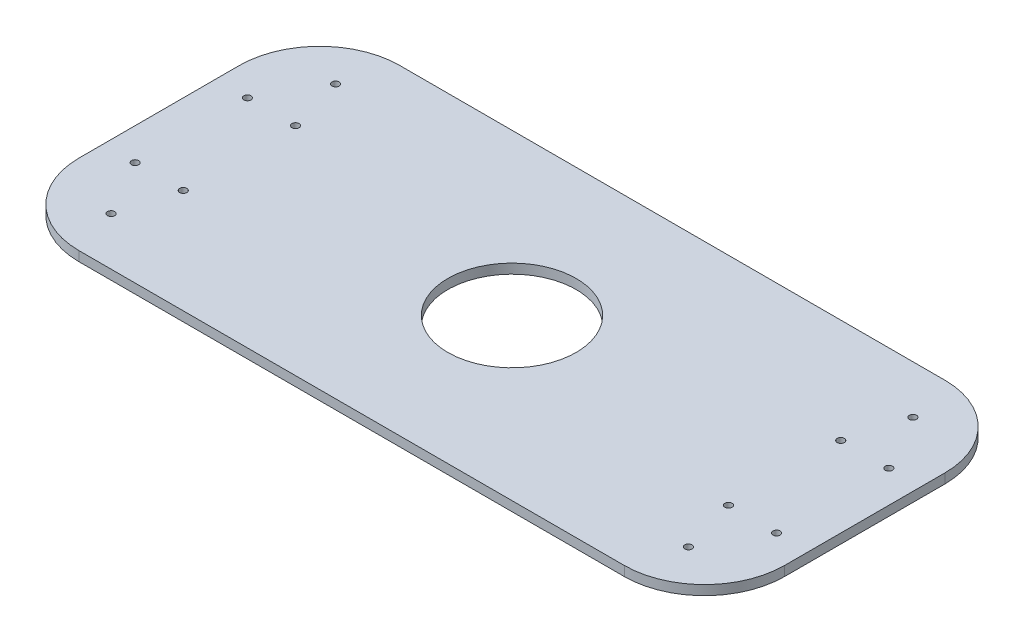
ISO-10303-21;
HEADER;
FILE_DESCRIPTION(('STEP AP214'),'2;1');
FILE_NAME('part.step','',(''),(''),'','','');
FILE_SCHEMA(('AUTOMOTIVE_DESIGN { 1 0 10303 214 1 1 1 1 }'));
ENDSEC;
DATA;
#1=APPLICATION_CONTEXT('core data for automotive mechanical design processes');
#2=APPLICATION_PROTOCOL_DEFINITION('international standard','automotive_design',2000,#1);
#3=PRODUCT_CONTEXT('',#1,'mechanical');
#4=PRODUCT('Part','Part','',(#3));
#5=PRODUCT_RELATED_PRODUCT_CATEGORY('part','',(#4));
#6=PRODUCT_DEFINITION_FORMATION('','',#4);
#7=PRODUCT_DEFINITION_CONTEXT('part definition',#1,'design');
#8=PRODUCT_DEFINITION('design','',#6,#7);
#9=PRODUCT_DEFINITION_SHAPE('','',#8);
#10=(LENGTH_UNIT() NAMED_UNIT(*) SI_UNIT(.MILLI.,.METRE.));
#11=(NAMED_UNIT(*) PLANE_ANGLE_UNIT() SI_UNIT($,.RADIAN.));
#12=(NAMED_UNIT(*) SI_UNIT($,.STERADIAN.) SOLID_ANGLE_UNIT());
#13=UNCERTAINTY_MEASURE_WITH_UNIT(LENGTH_MEASURE(1.E-05),#10,'distance_accuracy_value','');
#14=(GEOMETRIC_REPRESENTATION_CONTEXT(3) GLOBAL_UNCERTAINTY_ASSIGNED_CONTEXT((#13)) GLOBAL_UNIT_ASSIGNED_CONTEXT((#10,
#11,#12)) REPRESENTATION_CONTEXT('',''));
#15=CARTESIAN_POINT('',(0.,0.,0.));
#16=DIRECTION('',(0.,0.,1.));
#17=DIRECTION('',(1.,0.,0.));
#18=AXIS2_PLACEMENT_3D('',#15,#16,#17);
#19=CARTESIAN_POINT('',(0.,6.,0.));
#20=DIRECTION('',(0.,1.,0.));
#21=DIRECTION('',(0.,0.,1.));
#22=AXIS2_PLACEMENT_3D('',#19,#20,#21);
#23=PLANE('',#22);
#24=CARTESIAN_POINT('',(180.,6.,-70.));
#25=DIRECTION('',(0.,1.,0.));
#26=DIRECTION('',(0.,0.,1.));
#27=AXIS2_PLACEMENT_3D('',#24,#25,#26);
#28=CIRCLE('',#27,2.25000000000001);
#29=CARTESIAN_POINT('',(180.,6.,-67.75));
#30=VERTEX_POINT('',#29);
#31=EDGE_CURVE('E254',#30,#30,#28,.T.);
#32=ORIENTED_EDGE('',*,*,#31,.F.);
#33=EDGE_LOOP('',(#32));
#34=FACE_BOUND('',#33,.T.);
#35=CARTESIAN_POINT('',(170.,6.,-35.));
#36=DIRECTION('',(0.,1.,0.));
#37=DIRECTION('',(0.,0.,1.));
#38=AXIS2_PLACEMENT_3D('',#35,#36,#37);
#39=CIRCLE('',#38,2.25000000000001);
#40=CARTESIAN_POINT('',(170.,6.,-32.75));
#41=VERTEX_POINT('',#40);
#42=EDGE_CURVE('E258',#41,#41,#39,.T.);
#43=ORIENTED_EDGE('',*,*,#42,.F.);
#44=EDGE_LOOP('',(#43));
#45=FACE_BOUND('',#44,.T.);
#46=CARTESIAN_POINT('',(200.,6.,-35.));
#47=DIRECTION('',(0.,1.,0.));
#48=DIRECTION('',(0.,0.,1.));
#49=AXIS2_PLACEMENT_3D('',#46,#47,#48);
#50=CIRCLE('',#49,2.25000000000001);
#51=CARTESIAN_POINT('',(200.,6.,-32.75));
#52=VERTEX_POINT('',#51);
#53=EDGE_CURVE('E249',#52,#52,#50,.T.);
#54=ORIENTED_EDGE('',*,*,#53,.F.);
#55=EDGE_LOOP('',(#54));
#56=FACE_BOUND('',#55,.T.);
#57=CARTESIAN_POINT('',(-170.,6.,50.));
#58=DIRECTION('',(0.,1.,0.));
#59=DIRECTION('',(0.,0.,1.));
#60=AXIS2_PLACEMENT_3D('',#57,#58,#59);
#61=CIRCLE('',#60,50.);
#62=CARTESIAN_POINT('',(-170.,6.,100.));
#63=VERTEX_POINT('',#62);
#64=CARTESIAN_POINT('',(-220.,6.,50.));
#65=VERTEX_POINT('',#64);
#66=EDGE_CURVE('E241',#63,#65,#61,.F.);
#67=ORIENTED_EDGE('',*,*,#66,.F.);
#68=DIRECTION('',(1.,0.,0.));
#69=VECTOR('',#68,1.);
#70=CARTESIAN_POINT('',(-220.,6.,100.));
#71=LINE('',#70,#69);
#72=CARTESIAN_POINT('',(170.,6.,100.));
#73=VERTEX_POINT('',#72);
#74=EDGE_CURVE('E163',#63,#73,#71,.T.);
#75=ORIENTED_EDGE('',*,*,#74,.T.);
#76=CARTESIAN_POINT('',(170.,6.,50.));
#77=DIRECTION('',(0.,1.,0.));
#78=DIRECTION('',(0.,0.,1.));
#79=AXIS2_PLACEMENT_3D('',#76,#77,#78);
#80=CIRCLE('',#79,50.);
#81=CARTESIAN_POINT('',(220.,6.,50.));
#82=VERTEX_POINT('',#81);
#83=EDGE_CURVE('E147',#73,#82,#80,.T.);
#84=ORIENTED_EDGE('',*,*,#83,.T.);
#85=DIRECTION('',(0.,0.,-1.));
#86=VECTOR('',#85,1.);
#87=CARTESIAN_POINT('',(220.,6.,-100.));
#88=LINE('',#87,#86);
#89=CARTESIAN_POINT('',(220.,6.,-50.));
#90=VERTEX_POINT('',#89);
#91=EDGE_CURVE('E161',#82,#90,#88,.T.);
#92=ORIENTED_EDGE('',*,*,#91,.T.);
#93=CARTESIAN_POINT('',(170.,6.,-50.));
#94=DIRECTION('',(0.,1.,0.));
#95=DIRECTION('',(0.,0.,1.));
#96=AXIS2_PLACEMENT_3D('',#93,#94,#95);
#97=CIRCLE('',#96,50.);
#98=CARTESIAN_POINT('',(170.,6.,-100.));
#99=VERTEX_POINT('',#98);
#100=EDGE_CURVE('E268',#90,#99,#97,.T.);
#101=ORIENTED_EDGE('',*,*,#100,.T.);
#102=DIRECTION('',(-1.,0.,0.));
#103=VECTOR('',#102,1.);
#104=CARTESIAN_POINT('',(-220.,6.,-100.));
#105=LINE('',#104,#103);
#106=CARTESIAN_POINT('',(-170.,6.,-100.));
#107=VERTEX_POINT('',#106);
#108=EDGE_CURVE('E170',#99,#107,#105,.T.);
#109=ORIENTED_EDGE('',*,*,#108,.T.);
#110=CARTESIAN_POINT('',(-170.,6.,-50.));
#111=DIRECTION('',(0.,1.,0.));
#112=DIRECTION('',(0.,0.,1.));
#113=AXIS2_PLACEMENT_3D('',#110,#111,#112);
#114=CIRCLE('',#113,50.);
#115=CARTESIAN_POINT('',(-220.,6.,-50.));
#116=VERTEX_POINT('',#115);
#117=EDGE_CURVE('E242',#107,#116,#114,.T.);
#118=ORIENTED_EDGE('',*,*,#117,.T.);
#119=DIRECTION('',(0.,0.,1.));
#120=VECTOR('',#119,1.);
#121=CARTESIAN_POINT('',(-220.,6.,-100.));
#122=LINE('',#121,#120);
#123=EDGE_CURVE('E175',#116,#65,#122,.T.);
#124=ORIENTED_EDGE('',*,*,#123,.T.);
#125=EDGE_LOOP('',(#67,#75,#84,#92,#101,#109,#118,#124));
#126=FACE_BOUND('',#125,.T.);
#127=CARTESIAN_POINT('',(-170.,6.,-35.));
#128=DIRECTION('',(0.,1.,0.));
#129=DIRECTION('',(0.,0.,1.));
#130=AXIS2_PLACEMENT_3D('',#127,#128,#129);
#131=CIRCLE('',#130,2.25000000000001);
#132=CARTESIAN_POINT('',(-170.,6.,-32.75));
#133=VERTEX_POINT('',#132);
#134=EDGE_CURVE('E261',#133,#133,#131,.F.);
#135=ORIENTED_EDGE('',*,*,#134,.T.);
#136=EDGE_LOOP('',(#135));
#137=FACE_BOUND('',#136,.T.);
#138=CARTESIAN_POINT('',(180.,6.,70.));
#139=DIRECTION('',(0.,-1.,0.));
#140=DIRECTION('',(0.,0.,-1.));
#141=AXIS2_PLACEMENT_3D('',#138,#139,#140);
#142=CIRCLE('',#141,2.25000000000001);
#143=CARTESIAN_POINT('',(180.,6.,67.75));
#144=VERTEX_POINT('',#143);
#145=EDGE_CURVE('E508',#144,#144,#142,.T.);
#146=ORIENTED_EDGE('',*,*,#145,.T.);
#147=EDGE_LOOP('',(#146));
#148=FACE_BOUND('',#147,.T.);
#149=CARTESIAN_POINT('',(200.,6.,35.));
#150=DIRECTION('',(0.,-1.,0.));
#151=DIRECTION('',(0.,0.,-1.));
#152=AXIS2_PLACEMENT_3D('',#149,#150,#151);
#153=CIRCLE('',#152,2.25000000000001);
#154=CARTESIAN_POINT('',(200.,6.,32.75));
#155=VERTEX_POINT('',#154);
#156=EDGE_CURVE('E512',#155,#155,#153,.T.);
#157=ORIENTED_EDGE('',*,*,#156,.T.);
#158=EDGE_LOOP('',(#157));
#159=FACE_BOUND('',#158,.T.);
#160=CARTESIAN_POINT('',(-180.,6.,70.));
#161=DIRECTION('',(0.,1.,0.));
#162=DIRECTION('',(0.,0.,1.));
#163=AXIS2_PLACEMENT_3D('',#160,#161,#162);
#164=CIRCLE('',#163,2.25000000000001);
#165=CARTESIAN_POINT('',(-180.,6.,72.25));
#166=VERTEX_POINT('',#165);
#167=EDGE_CURVE('E510',#166,#166,#164,.T.);
#168=ORIENTED_EDGE('',*,*,#167,.F.);
#169=EDGE_LOOP('',(#168));
#170=FACE_BOUND('',#169,.T.);
#171=CARTESIAN_POINT('',(-170.,6.,35.));
#172=DIRECTION('',(0.,1.,0.));
#173=DIRECTION('',(0.,0.,1.));
#174=AXIS2_PLACEMENT_3D('',#171,#172,#173);
#175=CIRCLE('',#174,2.25000000000001);
#176=CARTESIAN_POINT('',(-170.,6.,37.25));
#177=VERTEX_POINT('',#176);
#178=EDGE_CURVE('E515',#177,#177,#175,.T.);
#179=ORIENTED_EDGE('',*,*,#178,.F.);
#180=EDGE_LOOP('',(#179));
#181=FACE_BOUND('',#180,.T.);
#182=CARTESIAN_POINT('',(-200.,6.,35.));
#183=DIRECTION('',(0.,1.,0.));
#184=DIRECTION('',(0.,0.,1.));
#185=AXIS2_PLACEMENT_3D('',#182,#183,#184);
#186=CIRCLE('',#185,2.25000000000001);
#187=CARTESIAN_POINT('',(-200.,6.,37.25));
#188=VERTEX_POINT('',#187);
#189=EDGE_CURVE('E521',#188,#188,#186,.T.);
#190=ORIENTED_EDGE('',*,*,#189,.F.);
#191=EDGE_LOOP('',(#190));
#192=FACE_BOUND('',#191,.T.);
#193=CARTESIAN_POINT('',(0.,6.,0.));
#194=DIRECTION('',(0.,1.,0.));
#195=DIRECTION('',(0.,0.,1.));
#196=AXIS2_PLACEMENT_3D('',#193,#194,#195);
#197=CIRCLE('',#196,40.);
#198=CARTESIAN_POINT('',(0.,6.,40.));
#199=VERTEX_POINT('',#198);
#200=EDGE_CURVE('E183',#199,#199,#197,.T.);
#201=ORIENTED_EDGE('',*,*,#200,.F.);
#202=EDGE_LOOP('',(#201));
#203=FACE_BOUND('',#202,.T.);
#204=CARTESIAN_POINT('',(170.,6.,35.));
#205=DIRECTION('',(0.,-1.,0.));
#206=DIRECTION('',(0.,0.,-1.));
#207=AXIS2_PLACEMENT_3D('',#204,#205,#206);
#208=CIRCLE('',#207,2.25000000000001);
#209=CARTESIAN_POINT('',(170.,6.,32.75));
#210=VERTEX_POINT('',#209);
#211=EDGE_CURVE('E336',#210,#210,#208,.T.);
#212=ORIENTED_EDGE('',*,*,#211,.T.);
#213=EDGE_LOOP('',(#212));
#214=FACE_BOUND('',#213,.T.);
#215=CARTESIAN_POINT('',(-180.,6.,-70.));
#216=DIRECTION('',(0.,1.,0.));
#217=DIRECTION('',(0.,0.,1.));
#218=AXIS2_PLACEMENT_3D('',#215,#216,#217);
#219=CIRCLE('',#218,2.25000000000001);
#220=CARTESIAN_POINT('',(-180.,6.,-67.75));
#221=VERTEX_POINT('',#220);
#222=EDGE_CURVE('E257',#221,#221,#219,.F.);
#223=ORIENTED_EDGE('',*,*,#222,.T.);
#224=EDGE_LOOP('',(#223));
#225=FACE_BOUND('',#224,.T.);
#226=CARTESIAN_POINT('',(-200.,6.,-35.));
#227=DIRECTION('',(0.,1.,0.));
#228=DIRECTION('',(0.,0.,1.));
#229=AXIS2_PLACEMENT_3D('',#226,#227,#228);
#230=CIRCLE('',#229,2.25000000000001);
#231=CARTESIAN_POINT('',(-200.,6.,-32.75));
#232=VERTEX_POINT('',#231);
#233=EDGE_CURVE('E264',#232,#232,#230,.F.);
#234=ORIENTED_EDGE('',*,*,#233,.T.);
#235=EDGE_LOOP('',(#234));
#236=FACE_BOUND('',#235,.T.);
#237=ADVANCED_FACE('F82',(#34,#45,#56,#126,#137,#148,#159,#170,#181,#192,#203,#214,#225,#236),
#23,.T.);
#238=CARTESIAN_POINT('',(0.,0.,0.));
#239=DIRECTION('',(0.,1.,0.));
#240=DIRECTION('',(0.,0.,1.));
#241=AXIS2_PLACEMENT_3D('',#238,#239,#240);
#242=PLANE('',#241);
#243=CARTESIAN_POINT('',(180.,0.,-70.));
#244=DIRECTION('',(0.,1.,0.));
#245=DIRECTION('',(0.,0.,1.));
#246=AXIS2_PLACEMENT_3D('',#243,#244,#245);
#247=CIRCLE('',#246,2.25000000000001);
#248=CARTESIAN_POINT('',(180.,0.,-67.75));
#249=VERTEX_POINT('',#248);
#250=EDGE_CURVE('E86',#249,#249,#247,.T.);
#251=ORIENTED_EDGE('',*,*,#250,.T.);
#252=EDGE_LOOP('',(#251));
#253=FACE_BOUND('',#252,.T.);
#254=CARTESIAN_POINT('',(170.,0.,-35.));
#255=DIRECTION('',(0.,1.,0.));
#256=DIRECTION('',(0.,0.,1.));
#257=AXIS2_PLACEMENT_3D('',#254,#255,#256);
#258=CIRCLE('',#257,2.25000000000001);
#259=CARTESIAN_POINT('',(170.,0.,-32.75));
#260=VERTEX_POINT('',#259);
#261=EDGE_CURVE('E223',#260,#260,#258,.T.);
#262=ORIENTED_EDGE('',*,*,#261,.T.);
#263=EDGE_LOOP('',(#262));
#264=FACE_BOUND('',#263,.T.);
#265=CARTESIAN_POINT('',(200.,0.,-35.));
#266=DIRECTION('',(0.,1.,0.));
#267=DIRECTION('',(0.,0.,1.));
#268=AXIS2_PLACEMENT_3D('',#265,#266,#267);
#269=CIRCLE('',#268,2.25000000000001);
#270=CARTESIAN_POINT('',(200.,0.,-32.75));
#271=VERTEX_POINT('',#270);
#272=EDGE_CURVE('E221',#271,#271,#269,.T.);
#273=ORIENTED_EDGE('',*,*,#272,.T.);
#274=EDGE_LOOP('',(#273));
#275=FACE_BOUND('',#274,.T.);
#276=CARTESIAN_POINT('',(-200.,0.,-35.));
#277=DIRECTION('',(0.,1.,0.));
#278=DIRECTION('',(0.,0.,1.));
#279=AXIS2_PLACEMENT_3D('',#276,#277,#278);
#280=CIRCLE('',#279,2.25000000000001);
#281=CARTESIAN_POINT('',(-200.,0.,-32.75));
#282=VERTEX_POINT('',#281);
#283=EDGE_CURVE('E218',#282,#282,#280,.F.);
#284=ORIENTED_EDGE('',*,*,#283,.F.);
#285=EDGE_LOOP('',(#284));
#286=FACE_BOUND('',#285,.T.);
#287=CARTESIAN_POINT('',(-170.,0.,-35.));
#288=DIRECTION('',(0.,1.,0.));
#289=DIRECTION('',(0.,0.,1.));
#290=AXIS2_PLACEMENT_3D('',#287,#288,#289);
#291=CIRCLE('',#290,2.25000000000001);
#292=CARTESIAN_POINT('',(-170.,0.,-32.75));
#293=VERTEX_POINT('',#292);
#294=EDGE_CURVE('E215',#293,#293,#291,.F.);
#295=ORIENTED_EDGE('',*,*,#294,.F.);
#296=EDGE_LOOP('',(#295));
#297=FACE_BOUND('',#296,.T.);
#298=CARTESIAN_POINT('',(-180.,0.,-70.));
#299=DIRECTION('',(0.,1.,0.));
#300=DIRECTION('',(0.,0.,1.));
#301=AXIS2_PLACEMENT_3D('',#298,#299,#300);
#302=CIRCLE('',#301,2.25000000000001);
#303=CARTESIAN_POINT('',(-180.,0.,-67.75));
#304=VERTEX_POINT('',#303);
#305=EDGE_CURVE('E212',#304,#304,#302,.F.);
#306=ORIENTED_EDGE('',*,*,#305,.F.);
#307=EDGE_LOOP('',(#306));
#308=FACE_BOUND('',#307,.T.);
#309=CARTESIAN_POINT('',(180.,0.,70.));
#310=DIRECTION('',(0.,1.,0.));
#311=DIRECTION('',(0.,0.,1.));
#312=AXIS2_PLACEMENT_3D('',#309,#310,#311);
#313=CIRCLE('',#312,2.25000000000001);
#314=CARTESIAN_POINT('',(180.,0.,72.25));
#315=VERTEX_POINT('',#314);
#316=EDGE_CURVE('E209',#315,#315,#313,.F.);
#317=ORIENTED_EDGE('',*,*,#316,.F.);
#318=EDGE_LOOP('',(#317));
#319=FACE_BOUND('',#318,.T.);
#320=CARTESIAN_POINT('',(170.,0.,35.));
#321=DIRECTION('',(0.,1.,0.));
#322=DIRECTION('',(0.,0.,1.));
#323=AXIS2_PLACEMENT_3D('',#320,#321,#322);
#324=CIRCLE('',#323,2.25000000000001);
#325=CARTESIAN_POINT('',(170.,0.,37.25));
#326=VERTEX_POINT('',#325);
#327=EDGE_CURVE('E206',#326,#326,#324,.F.);
#328=ORIENTED_EDGE('',*,*,#327,.F.);
#329=EDGE_LOOP('',(#328));
#330=FACE_BOUND('',#329,.T.);
#331=CARTESIAN_POINT('',(200.,0.,35.));
#332=DIRECTION('',(0.,1.,0.));
#333=DIRECTION('',(0.,0.,1.));
#334=AXIS2_PLACEMENT_3D('',#331,#332,#333);
#335=CIRCLE('',#334,2.25000000000001);
#336=CARTESIAN_POINT('',(200.,0.,37.25));
#337=VERTEX_POINT('',#336);
#338=EDGE_CURVE('E203',#337,#337,#335,.F.);
#339=ORIENTED_EDGE('',*,*,#338,.F.);
#340=EDGE_LOOP('',(#339));
#341=FACE_BOUND('',#340,.T.);
#342=CARTESIAN_POINT('',(-180.,0.,70.));
#343=DIRECTION('',(0.,1.,0.));
#344=DIRECTION('',(0.,0.,1.));
#345=AXIS2_PLACEMENT_3D('',#342,#343,#344);
#346=CIRCLE('',#345,2.25000000000001);
#347=CARTESIAN_POINT('',(-180.,0.,72.25));
#348=VERTEX_POINT('',#347);
#349=EDGE_CURVE('E200',#348,#348,#346,.T.);
#350=ORIENTED_EDGE('',*,*,#349,.T.);
#351=EDGE_LOOP('',(#350));
#352=FACE_BOUND('',#351,.T.);
#353=CARTESIAN_POINT('',(-170.,0.,35.));
#354=DIRECTION('',(0.,1.,0.));
#355=DIRECTION('',(0.,0.,1.));
#356=AXIS2_PLACEMENT_3D('',#353,#354,#355);
#357=CIRCLE('',#356,2.25000000000001);
#358=CARTESIAN_POINT('',(-170.,0.,37.25));
#359=VERTEX_POINT('',#358);
#360=EDGE_CURVE('E197',#359,#359,#357,.T.);
#361=ORIENTED_EDGE('',*,*,#360,.T.);
#362=EDGE_LOOP('',(#361));
#363=FACE_BOUND('',#362,.T.);
#364=CARTESIAN_POINT('',(-200.,0.,35.));
#365=DIRECTION('',(0.,1.,0.));
#366=DIRECTION('',(0.,0.,1.));
#367=AXIS2_PLACEMENT_3D('',#364,#365,#366);
#368=CIRCLE('',#367,2.25000000000001);
#369=CARTESIAN_POINT('',(-200.,0.,37.25));
#370=VERTEX_POINT('',#369);
#371=EDGE_CURVE('E194',#370,#370,#368,.T.);
#372=ORIENTED_EDGE('',*,*,#371,.T.);
#373=EDGE_LOOP('',(#372));
#374=FACE_BOUND('',#373,.T.);
#375=CARTESIAN_POINT('',(0.,0.,0.));
#376=DIRECTION('',(0.,1.,0.));
#377=DIRECTION('',(0.,0.,1.));
#378=AXIS2_PLACEMENT_3D('',#375,#376,#377);
#379=CIRCLE('',#378,40.);
#380=CARTESIAN_POINT('',(0.,0.,40.));
#381=VERTEX_POINT('',#380);
#382=EDGE_CURVE('E228',#381,#381,#379,.T.);
#383=ORIENTED_EDGE('',*,*,#382,.T.);
#384=EDGE_LOOP('',(#383));
#385=FACE_BOUND('',#384,.T.);
#386=DIRECTION('',(1.,0.,0.));
#387=VECTOR('',#386,1.);
#388=CARTESIAN_POINT('',(-220.,0.,100.));
#389=LINE('',#388,#387);
#390=CARTESIAN_POINT('',(-170.,0.,100.));
#391=VERTEX_POINT('',#390);
#392=CARTESIAN_POINT('',(170.,0.,100.));
#393=VERTEX_POINT('',#392);
#394=EDGE_CURVE('E182',#391,#393,#389,.T.);
#395=ORIENTED_EDGE('',*,*,#394,.F.);
#396=CARTESIAN_POINT('',(-170.,0.,50.));
#397=DIRECTION('',(0.,1.,0.));
#398=DIRECTION('',(0.,0.,1.));
#399=AXIS2_PLACEMENT_3D('',#396,#397,#398);
#400=CIRCLE('',#399,50.);
#401=CARTESIAN_POINT('',(-220.,0.,50.));
#402=VERTEX_POINT('',#401);
#403=EDGE_CURVE('E99',#391,#402,#400,.F.);
#404=ORIENTED_EDGE('',*,*,#403,.T.);
#405=DIRECTION('',(0.,0.,1.));
#406=VECTOR('',#405,1.);
#407=CARTESIAN_POINT('',(-220.,0.,-100.));
#408=LINE('',#407,#406);
#409=CARTESIAN_POINT('',(-220.,0.,-50.));
#410=VERTEX_POINT('',#409);
#411=EDGE_CURVE('E179',#410,#402,#408,.T.);
#412=ORIENTED_EDGE('',*,*,#411,.F.);
#413=CARTESIAN_POINT('',(-170.,0.,-50.));
#414=DIRECTION('',(0.,1.,0.));
#415=DIRECTION('',(0.,0.,1.));
#416=AXIS2_PLACEMENT_3D('',#413,#414,#415);
#417=CIRCLE('',#416,50.);
#418=CARTESIAN_POINT('',(-170.,0.,-100.));
#419=VERTEX_POINT('',#418);
#420=EDGE_CURVE('E274',#419,#410,#417,.T.);
#421=ORIENTED_EDGE('',*,*,#420,.F.);
#422=DIRECTION('',(-1.,0.,0.));
#423=VECTOR('',#422,1.);
#424=CARTESIAN_POINT('',(-220.,0.,-100.));
#425=LINE('',#424,#423);
#426=CARTESIAN_POINT('',(170.,0.,-100.));
#427=VERTEX_POINT('',#426);
#428=EDGE_CURVE('E188',#427,#419,#425,.T.);
#429=ORIENTED_EDGE('',*,*,#428,.F.);
#430=CARTESIAN_POINT('',(170.,0.,-50.));
#431=DIRECTION('',(0.,1.,0.));
#432=DIRECTION('',(0.,0.,1.));
#433=AXIS2_PLACEMENT_3D('',#430,#431,#432);
#434=CIRCLE('',#433,50.);
#435=CARTESIAN_POINT('',(220.,0.,-50.));
#436=VERTEX_POINT('',#435);
#437=EDGE_CURVE('E276',#436,#427,#434,.T.);
#438=ORIENTED_EDGE('',*,*,#437,.F.);
#439=DIRECTION('',(0.,0.,-1.));
#440=VECTOR('',#439,1.);
#441=CARTESIAN_POINT('',(220.,0.,-100.));
#442=LINE('',#441,#440);
#443=CARTESIAN_POINT('',(220.,0.,50.));
#444=VERTEX_POINT('',#443);
#445=EDGE_CURVE('E186',#444,#436,#442,.T.);
#446=ORIENTED_EDGE('',*,*,#445,.F.);
#447=CARTESIAN_POINT('',(170.,0.,50.));
#448=DIRECTION('',(0.,1.,0.));
#449=DIRECTION('',(0.,0.,1.));
#450=AXIS2_PLACEMENT_3D('',#447,#448,#449);
#451=CIRCLE('',#450,50.);
#452=EDGE_CURVE('E106',#393,#444,#451,.T.);
#453=ORIENTED_EDGE('',*,*,#452,.F.);
#454=EDGE_LOOP('',(#395,#404,#412,#421,#429,#438,#446,#453));
#455=FACE_BOUND('',#454,.T.);
#456=ADVANCED_FACE('F280',(#253,#264,#275,#286,#297,#308,#319,#330,#341,#352,#363,#374,#385,
#455),#242,.F.);
#457=CARTESIAN_POINT('',(-220.,6.,-100.));
#458=DIRECTION('',(1.,0.,0.));
#459=DIRECTION('',(0.,0.,-1.));
#460=AXIS2_PLACEMENT_3D('',#457,#458,#459);
#461=PLANE('',#460);
#462=DIRECTION('',(0.,1.,0.));
#463=VECTOR('',#462,1.);
#464=CARTESIAN_POINT('',(-220.,-4.,50.));
#465=LINE('',#464,#463);
#466=EDGE_CURVE('E164',#402,#65,#465,.T.);
#467=ORIENTED_EDGE('',*,*,#466,.T.);
#468=ORIENTED_EDGE('',*,*,#123,.F.);
#469=DIRECTION('',(0.,1.,0.));
#470=VECTOR('',#469,1.);
#471=CARTESIAN_POINT('',(-220.,-4.,-50.));
#472=LINE('',#471,#470);
#473=EDGE_CURVE('E246',#410,#116,#472,.T.);
#474=ORIENTED_EDGE('',*,*,#473,.F.);
#475=ORIENTED_EDGE('',*,*,#411,.T.);
#476=EDGE_LOOP('',(#467,#468,#474,#475));
#477=FACE_BOUND('',#476,.T.);
#478=ADVANCED_FACE('F84',(#477),#461,.F.);
#479=CARTESIAN_POINT('',(220.,6.,-100.));
#480=DIRECTION('',(-1.,0.,0.));
#481=DIRECTION('',(0.,0.,1.));
#482=AXIS2_PLACEMENT_3D('',#479,#480,#481);
#483=PLANE('',#482);
#484=ORIENTED_EDGE('',*,*,#445,.T.);
#485=DIRECTION('',(0.,1.,0.));
#486=VECTOR('',#485,1.);
#487=CARTESIAN_POINT('',(220.,-4.,-50.));
#488=LINE('',#487,#486);
#489=EDGE_CURVE('E169',#436,#90,#488,.T.);
#490=ORIENTED_EDGE('',*,*,#489,.T.);
#491=ORIENTED_EDGE('',*,*,#91,.F.);
#492=DIRECTION('',(0.,1.,0.));
#493=VECTOR('',#492,1.);
#494=CARTESIAN_POINT('',(220.,-4.,50.));
#495=LINE('',#494,#493);
#496=EDGE_CURVE('E91',#444,#82,#495,.T.);
#497=ORIENTED_EDGE('',*,*,#496,.F.);
#498=EDGE_LOOP('',(#484,#490,#491,#497));
#499=FACE_BOUND('',#498,.T.);
#500=ADVANCED_FACE('F168',(#499),#483,.F.);
#501=CARTESIAN_POINT('',(-220.,6.,-100.));
#502=DIRECTION('',(0.,0.,1.));
#503=DIRECTION('',(1.,0.,0.));
#504=AXIS2_PLACEMENT_3D('',#501,#502,#503);
#505=PLANE('',#504);
#506=DIRECTION('',(0.,1.,0.));
#507=VECTOR('',#506,1.);
#508=CARTESIAN_POINT('',(170.,-4.,-100.));
#509=LINE('',#508,#507);
#510=EDGE_CURVE('E153',#427,#99,#509,.T.);
#511=ORIENTED_EDGE('',*,*,#510,.F.);
#512=ORIENTED_EDGE('',*,*,#428,.T.);
#513=DIRECTION('',(0.,1.,0.));
#514=VECTOR('',#513,1.);
#515=CARTESIAN_POINT('',(-170.,-4.,-100.));
#516=LINE('',#515,#514);
#517=EDGE_CURVE('E173',#419,#107,#516,.T.);
#518=ORIENTED_EDGE('',*,*,#517,.T.);
#519=ORIENTED_EDGE('',*,*,#108,.F.);
#520=EDGE_LOOP('',(#511,#512,#518,#519));
#521=FACE_BOUND('',#520,.T.);
#522=ADVANCED_FACE('F313',(#521),#505,.F.);
#523=CARTESIAN_POINT('',(-220.,6.,100.));
#524=DIRECTION('',(0.,0.,-1.));
#525=DIRECTION('',(-1.,0.,0.));
#526=AXIS2_PLACEMENT_3D('',#523,#524,#525);
#527=PLANE('',#526);
#528=ORIENTED_EDGE('',*,*,#74,.F.);
#529=DIRECTION('',(0.,1.,0.));
#530=VECTOR('',#529,1.);
#531=CARTESIAN_POINT('',(-170.,-4.,100.));
#532=LINE('',#531,#530);
#533=EDGE_CURVE('E12',#63,#391,#532,.F.);
#534=ORIENTED_EDGE('',*,*,#533,.T.);
#535=ORIENTED_EDGE('',*,*,#394,.T.);
#536=DIRECTION('',(0.,1.,0.));
#537=VECTOR('',#536,1.);
#538=CARTESIAN_POINT('',(170.,-4.,100.));
#539=LINE('',#538,#537);
#540=EDGE_CURVE('E165',#393,#73,#539,.T.);
#541=ORIENTED_EDGE('',*,*,#540,.T.);
#542=EDGE_LOOP('',(#528,#534,#535,#541));
#543=FACE_BOUND('',#542,.T.);
#544=ADVANCED_FACE('F283',(#543),#527,.F.);
#545=CARTESIAN_POINT('',(0.,6.,0.));
#546=DIRECTION('',(0.,-1.,0.));
#547=DIRECTION('',(0.,0.,-1.));
#548=AXIS2_PLACEMENT_3D('',#545,#546,#547);
#549=CYLINDRICAL_SURFACE('',#548,40.);
#550=ORIENTED_EDGE('',*,*,#200,.T.);
#551=EDGE_LOOP('',(#550));
#552=FACE_BOUND('',#551,.T.);
#553=ORIENTED_EDGE('',*,*,#382,.F.);
#554=EDGE_LOOP('',(#553));
#555=FACE_BOUND('',#554,.T.);
#556=ADVANCED_FACE('F310',(#552,#555),#549,.F.);
#557=CARTESIAN_POINT('',(-170.,-4.,-50.));
#558=DIRECTION('',(0.,1.,0.));
#559=DIRECTION('',(0.,0.,1.));
#560=AXIS2_PLACEMENT_3D('',#557,#558,#559);
#561=CYLINDRICAL_SURFACE('',#560,50.);
#562=ORIENTED_EDGE('',*,*,#420,.T.);
#563=ORIENTED_EDGE('',*,*,#473,.T.);
#564=ORIENTED_EDGE('',*,*,#117,.F.);
#565=ORIENTED_EDGE('',*,*,#517,.F.);
#566=EDGE_LOOP('',(#562,#563,#564,#565));
#567=FACE_BOUND('',#566,.T.);
#568=ADVANCED_FACE('F323',(#567),#561,.T.);
#569=CARTESIAN_POINT('',(170.,-4.,-50.));
#570=DIRECTION('',(0.,1.,0.));
#571=DIRECTION('',(0.,0.,1.));
#572=AXIS2_PLACEMENT_3D('',#569,#570,#571);
#573=CYLINDRICAL_SURFACE('',#572,50.);
#574=ORIENTED_EDGE('',*,*,#437,.T.);
#575=ORIENTED_EDGE('',*,*,#510,.T.);
#576=ORIENTED_EDGE('',*,*,#100,.F.);
#577=ORIENTED_EDGE('',*,*,#489,.F.);
#578=EDGE_LOOP('',(#574,#575,#576,#577));
#579=FACE_BOUND('',#578,.T.);
#580=ADVANCED_FACE('F295',(#579),#573,.T.);
#581=CARTESIAN_POINT('',(170.,-4.,50.));
#582=DIRECTION('',(0.,1.,0.));
#583=DIRECTION('',(0.,0.,1.));
#584=AXIS2_PLACEMENT_3D('',#581,#582,#583);
#585=CYLINDRICAL_SURFACE('',#584,50.);
#586=ORIENTED_EDGE('',*,*,#452,.T.);
#587=ORIENTED_EDGE('',*,*,#496,.T.);
#588=ORIENTED_EDGE('',*,*,#83,.F.);
#589=ORIENTED_EDGE('',*,*,#540,.F.);
#590=EDGE_LOOP('',(#586,#587,#588,#589));
#591=FACE_BOUND('',#590,.T.);
#592=ADVANCED_FACE('F146',(#591),#585,.T.);
#593=CARTESIAN_POINT('',(-170.,-4.,50.));
#594=DIRECTION('',(0.,1.,0.));
#595=DIRECTION('',(0.,0.,1.));
#596=AXIS2_PLACEMENT_3D('',#593,#594,#595);
#597=CYLINDRICAL_SURFACE('',#596,50.);
#598=ORIENTED_EDGE('',*,*,#533,.F.);
#599=ORIENTED_EDGE('',*,*,#66,.T.);
#600=ORIENTED_EDGE('',*,*,#466,.F.);
#601=ORIENTED_EDGE('',*,*,#403,.F.);
#602=EDGE_LOOP('',(#598,#599,#600,#601));
#603=FACE_BOUND('',#602,.T.);
#604=ADVANCED_FACE('F284',(#603),#597,.T.);
#605=CARTESIAN_POINT('',(-200.,-4.,35.));
#606=DIRECTION('',(0.,1.,0.));
#607=DIRECTION('',(0.,0.,1.));
#608=AXIS2_PLACEMENT_3D('',#605,#606,#607);
#609=CYLINDRICAL_SURFACE('',#608,2.25000000000001);
#610=ORIENTED_EDGE('',*,*,#189,.T.);
#611=EDGE_LOOP('',(#610));
#612=FACE_BOUND('',#611,.T.);
#613=ORIENTED_EDGE('',*,*,#371,.F.);
#614=EDGE_LOOP('',(#613));
#615=FACE_BOUND('',#614,.T.);
#616=ADVANCED_FACE('F286',(#612,#615),#609,.F.);
#617=CARTESIAN_POINT('',(-170.,-4.,35.));
#618=DIRECTION('',(0.,1.,0.));
#619=DIRECTION('',(0.,0.,1.));
#620=AXIS2_PLACEMENT_3D('',#617,#618,#619);
#621=CYLINDRICAL_SURFACE('',#620,2.25000000000001);
#622=ORIENTED_EDGE('',*,*,#178,.T.);
#623=EDGE_LOOP('',(#622));
#624=FACE_BOUND('',#623,.T.);
#625=ORIENTED_EDGE('',*,*,#360,.F.);
#626=EDGE_LOOP('',(#625));
#627=FACE_BOUND('',#626,.T.);
#628=ADVANCED_FACE('F292',(#624,#627),#621,.F.);
#629=CARTESIAN_POINT('',(-180.,-4.,70.));
#630=DIRECTION('',(0.,1.,0.));
#631=DIRECTION('',(0.,0.,1.));
#632=AXIS2_PLACEMENT_3D('',#629,#630,#631);
#633=CYLINDRICAL_SURFACE('',#632,2.25000000000001);
#634=ORIENTED_EDGE('',*,*,#167,.T.);
#635=EDGE_LOOP('',(#634));
#636=FACE_BOUND('',#635,.T.);
#637=ORIENTED_EDGE('',*,*,#349,.F.);
#638=EDGE_LOOP('',(#637));
#639=FACE_BOUND('',#638,.T.);
#640=ADVANCED_FACE('F368',(#636,#639),#633,.F.);
#641=CARTESIAN_POINT('',(200.,-4.,35.));
#642=DIRECTION('',(0.,1.,0.));
#643=DIRECTION('',(0.,0.,1.));
#644=AXIS2_PLACEMENT_3D('',#641,#642,#643);
#645=CYLINDRICAL_SURFACE('',#644,2.25000000000001);
#646=ORIENTED_EDGE('',*,*,#156,.F.);
#647=EDGE_LOOP('',(#646));
#648=FACE_BOUND('',#647,.T.);
#649=ORIENTED_EDGE('',*,*,#338,.T.);
#650=EDGE_LOOP('',(#649));
#651=FACE_BOUND('',#650,.T.);
#652=ADVANCED_FACE('F374',(#648,#651),#645,.F.);
#653=CARTESIAN_POINT('',(170.,-4.,35.));
#654=DIRECTION('',(0.,1.,0.));
#655=DIRECTION('',(0.,0.,1.));
#656=AXIS2_PLACEMENT_3D('',#653,#654,#655);
#657=CYLINDRICAL_SURFACE('',#656,2.25000000000001);
#658=ORIENTED_EDGE('',*,*,#211,.F.);
#659=EDGE_LOOP('',(#658));
#660=FACE_BOUND('',#659,.T.);
#661=ORIENTED_EDGE('',*,*,#327,.T.);
#662=EDGE_LOOP('',(#661));
#663=FACE_BOUND('',#662,.T.);
#664=ADVANCED_FACE('F451',(#660,#663),#657,.F.);
#665=CARTESIAN_POINT('',(180.,-4.,70.));
#666=DIRECTION('',(0.,1.,0.));
#667=DIRECTION('',(0.,0.,1.));
#668=AXIS2_PLACEMENT_3D('',#665,#666,#667);
#669=CYLINDRICAL_SURFACE('',#668,2.25000000000001);
#670=ORIENTED_EDGE('',*,*,#145,.F.);
#671=EDGE_LOOP('',(#670));
#672=FACE_BOUND('',#671,.T.);
#673=ORIENTED_EDGE('',*,*,#316,.T.);
#674=EDGE_LOOP('',(#673));
#675=FACE_BOUND('',#674,.T.);
#676=ADVANCED_FACE('F406',(#672,#675),#669,.F.);
#677=CARTESIAN_POINT('',(-180.,-4.,-70.));
#678=DIRECTION('',(0.,1.,0.));
#679=DIRECTION('',(0.,0.,1.));
#680=AXIS2_PLACEMENT_3D('',#677,#678,#679);
#681=CYLINDRICAL_SURFACE('',#680,2.25000000000001);
#682=ORIENTED_EDGE('',*,*,#222,.F.);
#683=EDGE_LOOP('',(#682));
#684=FACE_BOUND('',#683,.T.);
#685=ORIENTED_EDGE('',*,*,#305,.T.);
#686=EDGE_LOOP('',(#685));
#687=FACE_BOUND('',#686,.T.);
#688=ADVANCED_FACE('F402',(#684,#687),#681,.F.);
#689=CARTESIAN_POINT('',(-170.,-4.,-35.));
#690=DIRECTION('',(0.,1.,0.));
#691=DIRECTION('',(0.,0.,1.));
#692=AXIS2_PLACEMENT_3D('',#689,#690,#691);
#693=CYLINDRICAL_SURFACE('',#692,2.25000000000001);
#694=ORIENTED_EDGE('',*,*,#134,.F.);
#695=EDGE_LOOP('',(#694));
#696=FACE_BOUND('',#695,.T.);
#697=ORIENTED_EDGE('',*,*,#294,.T.);
#698=EDGE_LOOP('',(#697));
#699=FACE_BOUND('',#698,.T.);
#700=ADVANCED_FACE('F345',(#696,#699),#693,.F.);
#701=CARTESIAN_POINT('',(-200.,-4.,-35.));
#702=DIRECTION('',(0.,1.,0.));
#703=DIRECTION('',(0.,0.,1.));
#704=AXIS2_PLACEMENT_3D('',#701,#702,#703);
#705=CYLINDRICAL_SURFACE('',#704,2.25000000000001);
#706=ORIENTED_EDGE('',*,*,#233,.F.);
#707=EDGE_LOOP('',(#706));
#708=FACE_BOUND('',#707,.T.);
#709=ORIENTED_EDGE('',*,*,#283,.T.);
#710=EDGE_LOOP('',(#709));
#711=FACE_BOUND('',#710,.T.);
#712=ADVANCED_FACE('F341',(#708,#711),#705,.F.);
#713=CARTESIAN_POINT('',(200.,-4.,-35.));
#714=DIRECTION('',(0.,1.,0.));
#715=DIRECTION('',(0.,0.,1.));
#716=AXIS2_PLACEMENT_3D('',#713,#714,#715);
#717=CYLINDRICAL_SURFACE('',#716,2.25000000000001);
#718=ORIENTED_EDGE('',*,*,#53,.T.);
#719=EDGE_LOOP('',(#718));
#720=FACE_BOUND('',#719,.T.);
#721=ORIENTED_EDGE('',*,*,#272,.F.);
#722=EDGE_LOOP('',(#721));
#723=FACE_BOUND('',#722,.T.);
#724=ADVANCED_FACE('F344',(#720,#723),#717,.F.);
#725=CARTESIAN_POINT('',(170.,-4.,-35.));
#726=DIRECTION('',(0.,1.,0.));
#727=DIRECTION('',(0.,0.,1.));
#728=AXIS2_PLACEMENT_3D('',#725,#726,#727);
#729=CYLINDRICAL_SURFACE('',#728,2.25000000000001);
#730=ORIENTED_EDGE('',*,*,#42,.T.);
#731=EDGE_LOOP('',(#730));
#732=FACE_BOUND('',#731,.T.);
#733=ORIENTED_EDGE('',*,*,#261,.F.);
#734=EDGE_LOOP('',(#733));
#735=FACE_BOUND('',#734,.T.);
#736=ADVANCED_FACE('F380',(#732,#735),#729,.F.);
#737=CARTESIAN_POINT('',(180.,-4.,-70.));
#738=DIRECTION('',(0.,1.,0.));
#739=DIRECTION('',(0.,0.,1.));
#740=AXIS2_PLACEMENT_3D('',#737,#738,#739);
#741=CYLINDRICAL_SURFACE('',#740,2.25000000000001);
#742=ORIENTED_EDGE('',*,*,#31,.T.);
#743=EDGE_LOOP('',(#742));
#744=FACE_BOUND('',#743,.T.);
#745=ORIENTED_EDGE('',*,*,#250,.F.);
#746=EDGE_LOOP('',(#745));
#747=FACE_BOUND('',#746,.T.);
#748=ADVANCED_FACE('F385',(#744,#747),#741,.F.);
#749=CLOSED_SHELL('',(#237,#456,#478,#500,#522,#544,#556,#568,#580,#592,#604,#616,#628,#640,
#652,#664,#676,#688,#700,#712,#724,#736,#748));
#750=MANIFOLD_SOLID_BREP('B2',#749);
#751=ADVANCED_BREP_SHAPE_REPRESENTATION('',(#18,#750),#14);
#752=SHAPE_DEFINITION_REPRESENTATION(#9,#751);
ENDSEC;
END-ISO-10303-21;
